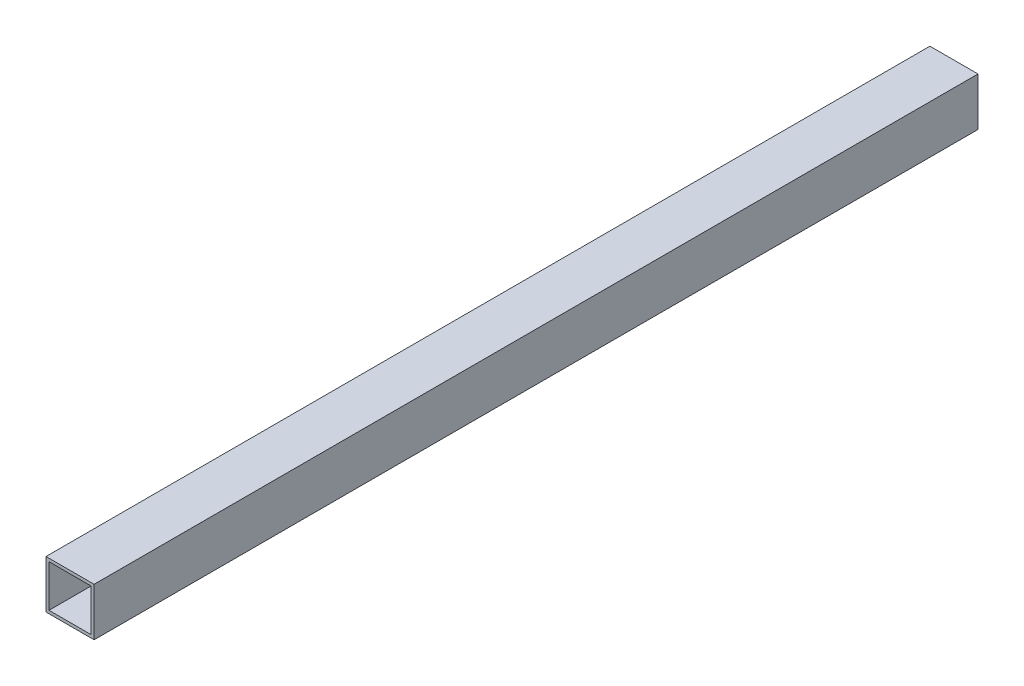
ISO-10303-21;
HEADER;
FILE_DESCRIPTION(('STEP AP214'),'2;1');
FILE_NAME('part.step','',(''),(''),'','','');
FILE_SCHEMA(('AUTOMOTIVE_DESIGN { 1 0 10303 214 1 1 1 1 }'));
ENDSEC;
DATA;
#1=APPLICATION_CONTEXT('core data for automotive mechanical design processes');
#2=APPLICATION_PROTOCOL_DEFINITION('international standard','automotive_design',2000,#1);
#3=PRODUCT_CONTEXT('',#1,'mechanical');
#4=PRODUCT('Part','Part','',(#3));
#5=PRODUCT_RELATED_PRODUCT_CATEGORY('part','',(#4));
#6=PRODUCT_DEFINITION_FORMATION('','',#4);
#7=PRODUCT_DEFINITION_CONTEXT('part definition',#1,'design');
#8=PRODUCT_DEFINITION('design','',#6,#7);
#9=PRODUCT_DEFINITION_SHAPE('','',#8);
#10=(LENGTH_UNIT() NAMED_UNIT(*) SI_UNIT(.MILLI.,.METRE.));
#11=(NAMED_UNIT(*) PLANE_ANGLE_UNIT() SI_UNIT($,.RADIAN.));
#12=(NAMED_UNIT(*) SI_UNIT($,.STERADIAN.) SOLID_ANGLE_UNIT());
#13=UNCERTAINTY_MEASURE_WITH_UNIT(LENGTH_MEASURE(1.E-05),#10,'distance_accuracy_value','');
#14=(GEOMETRIC_REPRESENTATION_CONTEXT(3) GLOBAL_UNCERTAINTY_ASSIGNED_CONTEXT((#13)) GLOBAL_UNIT_ASSIGNED_CONTEXT((#10,
#11,#12)) REPRESENTATION_CONTEXT('',''));
#15=CARTESIAN_POINT('',(0.,0.,0.));
#16=DIRECTION('',(0.,0.,1.));
#17=DIRECTION('',(1.,0.,0.));
#18=AXIS2_PLACEMENT_3D('',#15,#16,#17);
#19=CARTESIAN_POINT('',(0.,0.,1400.));
#20=DIRECTION('',(0.,0.,1.));
#21=DIRECTION('',(1.,0.,0.));
#22=AXIS2_PLACEMENT_3D('',#19,#20,#21);
#23=PLANE('',#22);
#24=DIRECTION('',(0.,-1.,0.));
#25=VECTOR('',#24,1.);
#26=CARTESIAN_POINT('',(0.,0.,1400.));
#27=LINE('',#26,#25);
#28=CARTESIAN_POINT('',(0.,0.,1400.));
#29=VERTEX_POINT('',#28);
#30=CARTESIAN_POINT('',(0.,-76.2,1400.));
#31=VERTEX_POINT('',#30);
#32=EDGE_CURVE('E136',#29,#31,#27,.T.);
#33=ORIENTED_EDGE('',*,*,#32,.T.);
#34=DIRECTION('',(1.,0.,0.));
#35=VECTOR('',#34,1.);
#36=CARTESIAN_POINT('',(0.,-76.2,1400.));
#37=LINE('',#36,#35);
#38=CARTESIAN_POINT('',(76.2,-76.2,1400.));
#39=VERTEX_POINT('',#38);
#40=EDGE_CURVE('E139',#31,#39,#37,.T.);
#41=ORIENTED_EDGE('',*,*,#40,.T.);
#42=DIRECTION('',(0.,1.,0.));
#43=VECTOR('',#42,1.);
#44=CARTESIAN_POINT('',(76.2,0.,1400.));
#45=LINE('',#44,#43);
#46=CARTESIAN_POINT('',(76.2,0.,1400.));
#47=VERTEX_POINT('',#46);
#48=EDGE_CURVE('E142',#39,#47,#45,.T.);
#49=ORIENTED_EDGE('',*,*,#48,.T.);
#50=DIRECTION('',(-1.,0.,0.));
#51=VECTOR('',#50,1.);
#52=CARTESIAN_POINT('',(0.,0.,1400.));
#53=LINE('',#52,#51);
#54=EDGE_CURVE('E144',#47,#29,#53,.T.);
#55=ORIENTED_EDGE('',*,*,#54,.T.);
#56=EDGE_LOOP('',(#33,#41,#49,#55));
#57=FACE_BOUND('',#56,.T.);
#58=DIRECTION('',(1.,0.,0.));
#59=VECTOR('',#58,1.);
#60=CARTESIAN_POINT('',(4.7625,-71.4375,1400.));
#61=LINE('',#60,#59);
#62=CARTESIAN_POINT('',(4.7625,-71.4375,1400.));
#63=VERTEX_POINT('',#62);
#64=CARTESIAN_POINT('',(71.4375,-71.4375,1400.));
#65=VERTEX_POINT('',#64);
#66=EDGE_CURVE('E108',#63,#65,#61,.T.);
#67=ORIENTED_EDGE('',*,*,#66,.F.);
#68=DIRECTION('',(0.,-1.,0.));
#69=VECTOR('',#68,1.);
#70=CARTESIAN_POINT('',(4.7625,-4.7625,1400.));
#71=LINE('',#70,#69);
#72=CARTESIAN_POINT('',(4.7625,-4.7625,1400.));
#73=VERTEX_POINT('',#72);
#74=EDGE_CURVE('E100',#73,#63,#71,.T.);
#75=ORIENTED_EDGE('',*,*,#74,.F.);
#76=DIRECTION('',(-1.,0.,0.));
#77=VECTOR('',#76,1.);
#78=CARTESIAN_POINT('',(4.7625,-4.7625,1400.));
#79=LINE('',#78,#77);
#80=CARTESIAN_POINT('',(71.4375,-4.7625,1400.));
#81=VERTEX_POINT('',#80);
#82=EDGE_CURVE('E122',#81,#73,#79,.T.);
#83=ORIENTED_EDGE('',*,*,#82,.F.);
#84=DIRECTION('',(0.,1.,0.));
#85=VECTOR('',#84,1.);
#86=CARTESIAN_POINT('',(71.4375,-4.7625,1400.));
#87=LINE('',#86,#85);
#88=EDGE_CURVE('E120',#65,#81,#87,.T.);
#89=ORIENTED_EDGE('',*,*,#88,.F.);
#90=EDGE_LOOP('',(#67,#75,#83,#89));
#91=FACE_BOUND('',#90,.T.);
#92=ADVANCED_FACE('F35',(#57,#91),#23,.T.);
#93=CARTESIAN_POINT('',(0.,0.,0.));
#94=DIRECTION('',(0.,0.,1.));
#95=DIRECTION('',(1.,0.,0.));
#96=AXIS2_PLACEMENT_3D('',#93,#94,#95);
#97=PLANE('',#96);
#98=DIRECTION('',(0.,-1.,0.));
#99=VECTOR('',#98,1.);
#100=CARTESIAN_POINT('',(0.,0.,0.));
#101=LINE('',#100,#99);
#102=CARTESIAN_POINT('',(0.,0.,0.));
#103=VERTEX_POINT('',#102);
#104=CARTESIAN_POINT('',(0.,-76.2,0.));
#105=VERTEX_POINT('',#104);
#106=EDGE_CURVE('E116',#103,#105,#101,.T.);
#107=ORIENTED_EDGE('',*,*,#106,.F.);
#108=DIRECTION('',(-1.,0.,0.));
#109=VECTOR('',#108,1.);
#110=CARTESIAN_POINT('',(0.,0.,0.));
#111=LINE('',#110,#109);
#112=CARTESIAN_POINT('',(76.2,0.,0.));
#113=VERTEX_POINT('',#112);
#114=EDGE_CURVE('E140',#113,#103,#111,.T.);
#115=ORIENTED_EDGE('',*,*,#114,.F.);
#116=DIRECTION('',(0.,1.,0.));
#117=VECTOR('',#116,1.);
#118=CARTESIAN_POINT('',(76.2,0.,0.));
#119=LINE('',#118,#117);
#120=CARTESIAN_POINT('',(76.2,-76.2,0.));
#121=VERTEX_POINT('',#120);
#122=EDGE_CURVE('E151',#121,#113,#119,.T.);
#123=ORIENTED_EDGE('',*,*,#122,.F.);
#124=DIRECTION('',(1.,0.,0.));
#125=VECTOR('',#124,1.);
#126=CARTESIAN_POINT('',(0.,-76.2,0.));
#127=LINE('',#126,#125);
#128=EDGE_CURVE('E149',#105,#121,#127,.T.);
#129=ORIENTED_EDGE('',*,*,#128,.F.);
#130=EDGE_LOOP('',(#107,#115,#123,#129));
#131=FACE_BOUND('',#130,.T.);
#132=DIRECTION('',(0.,-1.,0.));
#133=VECTOR('',#132,1.);
#134=CARTESIAN_POINT('',(4.7625,-4.7625,0.));
#135=LINE('',#134,#133);
#136=CARTESIAN_POINT('',(4.7625,-4.7625,0.));
#137=VERTEX_POINT('',#136);
#138=CARTESIAN_POINT('',(4.7625,-71.4375,0.));
#139=VERTEX_POINT('',#138);
#140=EDGE_CURVE('E58',#137,#139,#135,.T.);
#141=ORIENTED_EDGE('',*,*,#140,.T.);
#142=DIRECTION('',(1.,0.,0.));
#143=VECTOR('',#142,1.);
#144=CARTESIAN_POINT('',(4.7625,-71.4375,0.));
#145=LINE('',#144,#143);
#146=CARTESIAN_POINT('',(71.4375,-71.4375,0.));
#147=VERTEX_POINT('',#146);
#148=EDGE_CURVE('E115',#139,#147,#145,.T.);
#149=ORIENTED_EDGE('',*,*,#148,.T.);
#150=DIRECTION('',(0.,1.,0.));
#151=VECTOR('',#150,1.);
#152=CARTESIAN_POINT('',(71.4375,-4.7625,0.));
#153=LINE('',#152,#151);
#154=CARTESIAN_POINT('',(71.4375,-4.7625,0.));
#155=VERTEX_POINT('',#154);
#156=EDGE_CURVE('E128',#147,#155,#153,.T.);
#157=ORIENTED_EDGE('',*,*,#156,.T.);
#158=DIRECTION('',(-1.,0.,0.));
#159=VECTOR('',#158,1.);
#160=CARTESIAN_POINT('',(4.7625,-4.7625,0.));
#161=LINE('',#160,#159);
#162=EDGE_CURVE('E109',#155,#137,#161,.T.);
#163=ORIENTED_EDGE('',*,*,#162,.T.);
#164=EDGE_LOOP('',(#141,#149,#157,#163));
#165=FACE_BOUND('',#164,.T.);
#166=ADVANCED_FACE('F169',(#131,#165),#97,.F.);
#167=CARTESIAN_POINT('',(0.,0.,1400.));
#168=DIRECTION('',(1.,0.,0.));
#169=DIRECTION('',(0.,1.,0.));
#170=AXIS2_PLACEMENT_3D('',#167,#168,#169);
#171=PLANE('',#170);
#172=ORIENTED_EDGE('',*,*,#106,.T.);
#173=DIRECTION('',(0.,0.,-1.));
#174=VECTOR('',#173,1.);
#175=CARTESIAN_POINT('',(0.,-76.2,1400.));
#176=LINE('',#175,#174);
#177=EDGE_CURVE('E11',#31,#105,#176,.T.);
#178=ORIENTED_EDGE('',*,*,#177,.F.);
#179=ORIENTED_EDGE('',*,*,#32,.F.);
#180=DIRECTION('',(0.,0.,-1.));
#181=VECTOR('',#180,1.);
#182=CARTESIAN_POINT('',(0.,0.,1400.));
#183=LINE('',#182,#181);
#184=EDGE_CURVE('E146',#29,#103,#183,.T.);
#185=ORIENTED_EDGE('',*,*,#184,.T.);
#186=EDGE_LOOP('',(#172,#178,#179,#185));
#187=FACE_BOUND('',#186,.T.);
#188=ADVANCED_FACE('F37',(#187),#171,.F.);
#189=CARTESIAN_POINT('',(0.,-76.2,1400.));
#190=DIRECTION('',(0.,1.,0.));
#191=DIRECTION('',(0.,0.,1.));
#192=AXIS2_PLACEMENT_3D('',#189,#190,#191);
#193=PLANE('',#192);
#194=ORIENTED_EDGE('',*,*,#128,.T.);
#195=DIRECTION('',(0.,0.,-1.));
#196=VECTOR('',#195,1.);
#197=CARTESIAN_POINT('',(76.2,-76.2,1400.));
#198=LINE('',#197,#196);
#199=EDGE_CURVE('E43',#39,#121,#198,.T.);
#200=ORIENTED_EDGE('',*,*,#199,.F.);
#201=ORIENTED_EDGE('',*,*,#40,.F.);
#202=ORIENTED_EDGE('',*,*,#177,.T.);
#203=EDGE_LOOP('',(#194,#200,#201,#202));
#204=FACE_BOUND('',#203,.T.);
#205=ADVANCED_FACE('F179',(#204),#193,.F.);
#206=CARTESIAN_POINT('',(76.2,0.,1400.));
#207=DIRECTION('',(-1.,0.,0.));
#208=DIRECTION('',(0.,-1.,0.));
#209=AXIS2_PLACEMENT_3D('',#206,#207,#208);
#210=PLANE('',#209);
#211=ORIENTED_EDGE('',*,*,#122,.T.);
#212=DIRECTION('',(0.,0.,-1.));
#213=VECTOR('',#212,1.);
#214=CARTESIAN_POINT('',(76.2,0.,1400.));
#215=LINE('',#214,#213);
#216=EDGE_CURVE('E156',#47,#113,#215,.T.);
#217=ORIENTED_EDGE('',*,*,#216,.F.);
#218=ORIENTED_EDGE('',*,*,#48,.F.);
#219=ORIENTED_EDGE('',*,*,#199,.T.);
#220=EDGE_LOOP('',(#211,#217,#218,#219));
#221=FACE_BOUND('',#220,.T.);
#222=ADVANCED_FACE('F163',(#221),#210,.F.);
#223=CARTESIAN_POINT('',(0.,0.,1400.));
#224=DIRECTION('',(0.,-1.,0.));
#225=DIRECTION('',(0.,0.,-1.));
#226=AXIS2_PLACEMENT_3D('',#223,#224,#225);
#227=PLANE('',#226);
#228=ORIENTED_EDGE('',*,*,#114,.T.);
#229=ORIENTED_EDGE('',*,*,#184,.F.);
#230=ORIENTED_EDGE('',*,*,#54,.F.);
#231=ORIENTED_EDGE('',*,*,#216,.T.);
#232=EDGE_LOOP('',(#228,#229,#230,#231));
#233=FACE_BOUND('',#232,.T.);
#234=ADVANCED_FACE('F173',(#233),#227,.F.);
#235=CARTESIAN_POINT('',(4.7625,-4.7625,1400.));
#236=DIRECTION('',(1.,0.,0.));
#237=DIRECTION('',(0.,0.,-1.));
#238=AXIS2_PLACEMENT_3D('',#235,#236,#237);
#239=PLANE('',#238);
#240=ORIENTED_EDGE('',*,*,#140,.F.);
#241=DIRECTION('',(0.,0.,-1.));
#242=VECTOR('',#241,1.);
#243=CARTESIAN_POINT('',(4.7625,-4.7625,1400.));
#244=LINE('',#243,#242);
#245=EDGE_CURVE('E104',#73,#137,#244,.T.);
#246=ORIENTED_EDGE('',*,*,#245,.F.);
#247=ORIENTED_EDGE('',*,*,#74,.T.);
#248=DIRECTION('',(0.,0.,-1.));
#249=VECTOR('',#248,1.);
#250=CARTESIAN_POINT('',(4.7625,-71.4375,1400.));
#251=LINE('',#250,#249);
#252=EDGE_CURVE('E103',#63,#139,#251,.T.);
#253=ORIENTED_EDGE('',*,*,#252,.T.);
#254=EDGE_LOOP('',(#240,#246,#247,#253));
#255=FACE_BOUND('',#254,.T.);
#256=ADVANCED_FACE('F102',(#255),#239,.T.);
#257=CARTESIAN_POINT('',(4.7625,-71.4375,1400.));
#258=DIRECTION('',(0.,1.,0.));
#259=DIRECTION('',(0.,0.,1.));
#260=AXIS2_PLACEMENT_3D('',#257,#258,#259);
#261=PLANE('',#260);
#262=ORIENTED_EDGE('',*,*,#148,.F.);
#263=ORIENTED_EDGE('',*,*,#252,.F.);
#264=ORIENTED_EDGE('',*,*,#66,.T.);
#265=DIRECTION('',(0.,0.,-1.));
#266=VECTOR('',#265,1.);
#267=CARTESIAN_POINT('',(71.4375,-71.4375,1400.));
#268=LINE('',#267,#266);
#269=EDGE_CURVE('E117',#65,#147,#268,.T.);
#270=ORIENTED_EDGE('',*,*,#269,.T.);
#271=EDGE_LOOP('',(#262,#263,#264,#270));
#272=FACE_BOUND('',#271,.T.);
#273=ADVANCED_FACE('F112',(#272),#261,.T.);
#274=CARTESIAN_POINT('',(71.4375,-4.7625,1400.));
#275=DIRECTION('',(-1.,0.,0.));
#276=DIRECTION('',(0.,0.,1.));
#277=AXIS2_PLACEMENT_3D('',#274,#275,#276);
#278=PLANE('',#277);
#279=ORIENTED_EDGE('',*,*,#156,.F.);
#280=ORIENTED_EDGE('',*,*,#269,.F.);
#281=ORIENTED_EDGE('',*,*,#88,.T.);
#282=DIRECTION('',(0.,0.,-1.));
#283=VECTOR('',#282,1.);
#284=CARTESIAN_POINT('',(71.4375,-4.7625,1400.));
#285=LINE('',#284,#283);
#286=EDGE_CURVE('E50',#81,#155,#285,.T.);
#287=ORIENTED_EDGE('',*,*,#286,.T.);
#288=EDGE_LOOP('',(#279,#280,#281,#287));
#289=FACE_BOUND('',#288,.T.);
#290=ADVANCED_FACE('F202',(#289),#278,.T.);
#291=CARTESIAN_POINT('',(4.7625,-4.7625,1400.));
#292=DIRECTION('',(0.,-1.,0.));
#293=DIRECTION('',(0.,0.,-1.));
#294=AXIS2_PLACEMENT_3D('',#291,#292,#293);
#295=PLANE('',#294);
#296=ORIENTED_EDGE('',*,*,#162,.F.);
#297=ORIENTED_EDGE('',*,*,#286,.F.);
#298=ORIENTED_EDGE('',*,*,#82,.T.);
#299=ORIENTED_EDGE('',*,*,#245,.T.);
#300=EDGE_LOOP('',(#296,#297,#298,#299));
#301=FACE_BOUND('',#300,.T.);
#302=ADVANCED_FACE('F206',(#301),#295,.T.);
#303=CLOSED_SHELL('',(#92,#166,#188,#205,#222,#234,#256,#273,#290,#302));
#304=MANIFOLD_SOLID_BREP('B2',#303);
#305=ADVANCED_BREP_SHAPE_REPRESENTATION('',(#18,#304),#14);
#306=SHAPE_DEFINITION_REPRESENTATION(#9,#305);
ENDSEC;
END-ISO-10303-21;
